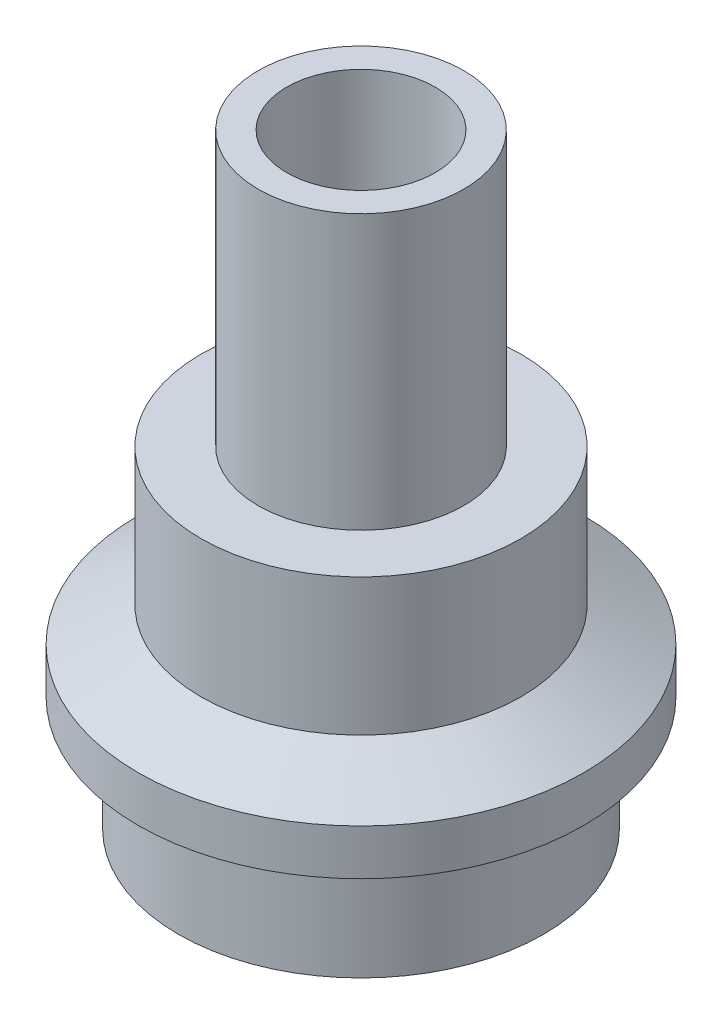
ISO-10303-21;
HEADER;
FILE_DESCRIPTION(('STEP AP214'),'2;1');
FILE_NAME('part.step','',(''),(''),'','','');
FILE_SCHEMA(('AUTOMOTIVE_DESIGN { 1 0 10303 214 1 1 1 1 }'));
ENDSEC;
DATA;
#1=APPLICATION_CONTEXT('core data for automotive mechanical design processes');
#2=APPLICATION_PROTOCOL_DEFINITION('international standard','automotive_design',2000,#1);
#3=PRODUCT_CONTEXT('',#1,'mechanical');
#4=PRODUCT('Part','Part','',(#3));
#5=PRODUCT_RELATED_PRODUCT_CATEGORY('part','',(#4));
#6=PRODUCT_DEFINITION_FORMATION('','',#4);
#7=PRODUCT_DEFINITION_CONTEXT('part definition',#1,'design');
#8=PRODUCT_DEFINITION('design','',#6,#7);
#9=PRODUCT_DEFINITION_SHAPE('','',#8);
#10=(LENGTH_UNIT() NAMED_UNIT(*) SI_UNIT(.MILLI.,.METRE.));
#11=(NAMED_UNIT(*) PLANE_ANGLE_UNIT() SI_UNIT($,.RADIAN.));
#12=(NAMED_UNIT(*) SI_UNIT($,.STERADIAN.) SOLID_ANGLE_UNIT());
#13=UNCERTAINTY_MEASURE_WITH_UNIT(LENGTH_MEASURE(1.E-05),#10,'distance_accuracy_value','');
#14=(GEOMETRIC_REPRESENTATION_CONTEXT(3) GLOBAL_UNCERTAINTY_ASSIGNED_CONTEXT((#13)) GLOBAL_UNIT_ASSIGNED_CONTEXT((#10,
#11,#12)) REPRESENTATION_CONTEXT('',''));
#15=CARTESIAN_POINT('',(0.,0.,0.));
#16=DIRECTION('',(0.,0.,1.));
#17=DIRECTION('',(1.,0.,0.));
#18=AXIS2_PLACEMENT_3D('',#15,#16,#17);
#19=CARTESIAN_POINT('',(0.,0.,0.));
#20=DIRECTION('',(0.,-1.,0.));
#21=DIRECTION('',(0.,0.,-1.));
#22=AXIS2_PLACEMENT_3D('',#19,#20,#21);
#23=CYLINDRICAL_SURFACE('',#22,11.);
#24=CARTESIAN_POINT('',(0.,0.,0.));
#25=DIRECTION('',(0.,-1.,0.));
#26=DIRECTION('',(0.,0.,-1.));
#27=AXIS2_PLACEMENT_3D('',#24,#25,#26);
#28=CIRCLE('',#27,11.);
#29=CARTESIAN_POINT('',(0.,0.,-11.));
#30=VERTEX_POINT('',#29);
#31=EDGE_CURVE('E12',#30,#30,#28,.T.);
#32=ORIENTED_EDGE('',*,*,#31,.T.);
#33=EDGE_LOOP('',(#32));
#34=FACE_BOUND('',#33,.T.);
#35=CARTESIAN_POINT('',(0.,11.,0.));
#36=DIRECTION('',(0.,-1.,0.));
#37=DIRECTION('',(0.,0.,-1.));
#38=AXIS2_PLACEMENT_3D('',#35,#36,#37);
#39=CIRCLE('',#38,11.);
#40=CARTESIAN_POINT('',(0.,11.,-11.));
#41=VERTEX_POINT('',#40);
#42=EDGE_CURVE('E102',#41,#41,#39,.T.);
#43=ORIENTED_EDGE('',*,*,#42,.F.);
#44=EDGE_LOOP('',(#43));
#45=FACE_BOUND('',#44,.T.);
#46=ADVANCED_FACE('F50',(#34,#45),#23,.F.);
#47=CARTESIAN_POINT('',(11.,0.,0.));
#48=DIRECTION('',(0.,-1.,0.));
#49=DIRECTION('',(0.,0.,-1.));
#50=AXIS2_PLACEMENT_3D('',#47,#48,#49);
#51=PLANE('',#50);
#52=CARTESIAN_POINT('',(0.,0.,0.));
#53=DIRECTION('',(0.,-1.,0.));
#54=DIRECTION('',(0.,0.,-1.));
#55=AXIS2_PLACEMENT_3D('',#52,#53,#54);
#56=CIRCLE('',#55,16.);
#57=CARTESIAN_POINT('',(0.,0.,-16.));
#58=VERTEX_POINT('',#57);
#59=EDGE_CURVE('E56',#58,#58,#56,.T.);
#60=ORIENTED_EDGE('',*,*,#59,.T.);
#61=EDGE_LOOP('',(#60));
#62=FACE_BOUND('',#61,.T.);
#63=ORIENTED_EDGE('',*,*,#31,.F.);
#64=EDGE_LOOP('',(#63));
#65=FACE_BOUND('',#64,.T.);
#66=ADVANCED_FACE('F110',(#62,#65),#51,.T.);
#67=CARTESIAN_POINT('',(0.,0.,0.));
#68=DIRECTION('',(0.,-1.,0.));
#69=DIRECTION('',(0.,0.,-1.));
#70=AXIS2_PLACEMENT_3D('',#67,#68,#69);
#71=CYLINDRICAL_SURFACE('',#70,16.);
#72=CARTESIAN_POINT('',(0.,10.,0.));
#73=DIRECTION('',(0.,-1.,0.));
#74=DIRECTION('',(0.,0.,-1.));
#75=AXIS2_PLACEMENT_3D('',#72,#73,#74);
#76=CIRCLE('',#75,16.);
#77=CARTESIAN_POINT('',(0.,10.,-16.));
#78=VERTEX_POINT('',#77);
#79=EDGE_CURVE('E60',#78,#78,#76,.T.);
#80=ORIENTED_EDGE('',*,*,#79,.T.);
#81=EDGE_LOOP('',(#80));
#82=FACE_BOUND('',#81,.T.);
#83=ORIENTED_EDGE('',*,*,#59,.F.);
#84=EDGE_LOOP('',(#83));
#85=FACE_BOUND('',#84,.T.);
#86=ADVANCED_FACE('F114',(#82,#85),#71,.T.);
#87=CARTESIAN_POINT('',(16.,10.,0.));
#88=DIRECTION('',(0.,-1.,0.));
#89=DIRECTION('',(0.,0.,-1.));
#90=AXIS2_PLACEMENT_3D('',#87,#88,#89);
#91=PLANE('',#90);
#92=CARTESIAN_POINT('',(0.,10.,0.));
#93=DIRECTION('',(0.,-1.,0.));
#94=DIRECTION('',(0.,0.,-1.));
#95=AXIS2_PLACEMENT_3D('',#92,#93,#94);
#96=CIRCLE('',#95,19.5);
#97=CARTESIAN_POINT('',(0.,10.,-19.5));
#98=VERTEX_POINT('',#97);
#99=EDGE_CURVE('E64',#98,#98,#96,.T.);
#100=ORIENTED_EDGE('',*,*,#99,.T.);
#101=EDGE_LOOP('',(#100));
#102=FACE_BOUND('',#101,.T.);
#103=ORIENTED_EDGE('',*,*,#79,.F.);
#104=EDGE_LOOP('',(#103));
#105=FACE_BOUND('',#104,.T.);
#106=ADVANCED_FACE('F118',(#102,#105),#91,.T.);
#107=CARTESIAN_POINT('',(0.,0.,0.));
#108=DIRECTION('',(0.,-1.,0.));
#109=DIRECTION('',(0.,0.,-1.));
#110=AXIS2_PLACEMENT_3D('',#107,#108,#109);
#111=CYLINDRICAL_SURFACE('',#110,19.5);
#112=CARTESIAN_POINT('',(0.,14.,0.));
#113=DIRECTION('',(0.,-1.,0.));
#114=DIRECTION('',(0.,0.,-1.));
#115=AXIS2_PLACEMENT_3D('',#112,#113,#114);
#116=CIRCLE('',#115,19.5);
#117=CARTESIAN_POINT('',(0.,14.,-19.5));
#118=VERTEX_POINT('',#117);
#119=EDGE_CURVE('E69',#118,#118,#116,.T.);
#120=ORIENTED_EDGE('',*,*,#119,.T.);
#121=EDGE_LOOP('',(#120));
#122=FACE_BOUND('',#121,.T.);
#123=ORIENTED_EDGE('',*,*,#99,.F.);
#124=EDGE_LOOP('',(#123));
#125=FACE_BOUND('',#124,.T.);
#126=ADVANCED_FACE('F125',(#122,#125),#111,.T.);
#127=CARTESIAN_POINT('',(0.,14.,0.));
#128=DIRECTION('',(0.,-1.,0.));
#129=DIRECTION('',(0.,0.,-1.));
#130=AXIS2_PLACEMENT_3D('',#127,#128,#129);
#131=CONICAL_SURFACE('',#130,19.5,1.07144960511477);
#132=CARTESIAN_POINT('',(0.,17.,0.));
#133=DIRECTION('',(0.,-1.,0.));
#134=DIRECTION('',(0.,0.,-1.));
#135=AXIS2_PLACEMENT_3D('',#132,#133,#134);
#136=CIRCLE('',#135,14.);
#137=CARTESIAN_POINT('',(0.,17.,-14.));
#138=VERTEX_POINT('',#137);
#139=EDGE_CURVE('E72',#138,#138,#136,.T.);
#140=ORIENTED_EDGE('',*,*,#139,.T.);
#141=EDGE_LOOP('',(#140));
#142=FACE_BOUND('',#141,.T.);
#143=ORIENTED_EDGE('',*,*,#119,.F.);
#144=EDGE_LOOP('',(#143));
#145=FACE_BOUND('',#144,.T.);
#146=ADVANCED_FACE('F129',(#142,#145),#131,.T.);
#147=CARTESIAN_POINT('',(0.,0.,0.));
#148=DIRECTION('',(0.,-1.,0.));
#149=DIRECTION('',(0.,0.,-1.));
#150=AXIS2_PLACEMENT_3D('',#147,#148,#149);
#151=CYLINDRICAL_SURFACE('',#150,14.);
#152=CARTESIAN_POINT('',(0.,29.,0.));
#153=DIRECTION('',(0.,-1.,0.));
#154=DIRECTION('',(0.,0.,-1.));
#155=AXIS2_PLACEMENT_3D('',#152,#153,#154);
#156=CIRCLE('',#155,14.);
#157=CARTESIAN_POINT('',(0.,29.,-14.));
#158=VERTEX_POINT('',#157);
#159=EDGE_CURVE('E75',#158,#158,#156,.T.);
#160=ORIENTED_EDGE('',*,*,#159,.T.);
#161=EDGE_LOOP('',(#160));
#162=FACE_BOUND('',#161,.T.);
#163=ORIENTED_EDGE('',*,*,#139,.F.);
#164=EDGE_LOOP('',(#163));
#165=FACE_BOUND('',#164,.T.);
#166=ADVANCED_FACE('F133',(#162,#165),#151,.T.);
#167=CARTESIAN_POINT('',(14.,29.,0.));
#168=DIRECTION('',(0.,1.,0.));
#169=DIRECTION('',(0.,0.,1.));
#170=AXIS2_PLACEMENT_3D('',#167,#168,#169);
#171=PLANE('',#170);
#172=CARTESIAN_POINT('',(0.,29.,0.));
#173=DIRECTION('',(0.,-1.,0.));
#174=DIRECTION('',(0.,0.,-1.));
#175=AXIS2_PLACEMENT_3D('',#172,#173,#174);
#176=CIRCLE('',#175,9.);
#177=CARTESIAN_POINT('',(0.,29.,-9.));
#178=VERTEX_POINT('',#177);
#179=EDGE_CURVE('E78',#178,#178,#176,.T.);
#180=ORIENTED_EDGE('',*,*,#179,.T.);
#181=EDGE_LOOP('',(#180));
#182=FACE_BOUND('',#181,.T.);
#183=ORIENTED_EDGE('',*,*,#159,.F.);
#184=EDGE_LOOP('',(#183));
#185=FACE_BOUND('',#184,.T.);
#186=ADVANCED_FACE('F137',(#182,#185),#171,.T.);
#187=CARTESIAN_POINT('',(0.,0.,0.));
#188=DIRECTION('',(0.,-1.,0.));
#189=DIRECTION('',(0.,0.,-1.));
#190=AXIS2_PLACEMENT_3D('',#187,#188,#189);
#191=CYLINDRICAL_SURFACE('',#190,9.);
#192=CARTESIAN_POINT('',(0.,53.,0.));
#193=DIRECTION('',(0.,-1.,0.));
#194=DIRECTION('',(0.,0.,-1.));
#195=AXIS2_PLACEMENT_3D('',#192,#193,#194);
#196=CIRCLE('',#195,9.);
#197=CARTESIAN_POINT('',(0.,53.,-9.));
#198=VERTEX_POINT('',#197);
#199=EDGE_CURVE('E81',#198,#198,#196,.T.);
#200=ORIENTED_EDGE('',*,*,#199,.T.);
#201=EDGE_LOOP('',(#200));
#202=FACE_BOUND('',#201,.T.);
#203=ORIENTED_EDGE('',*,*,#179,.F.);
#204=EDGE_LOOP('',(#203));
#205=FACE_BOUND('',#204,.T.);
#206=ADVANCED_FACE('F141',(#202,#205),#191,.T.);
#207=CARTESIAN_POINT('',(9.,53.,0.));
#208=DIRECTION('',(0.,1.,0.));
#209=DIRECTION('',(0.,0.,1.));
#210=AXIS2_PLACEMENT_3D('',#207,#208,#209);
#211=PLANE('',#210);
#212=CARTESIAN_POINT('',(0.,53.,0.));
#213=DIRECTION('',(0.,-1.,0.));
#214=DIRECTION('',(0.,0.,-1.));
#215=AXIS2_PLACEMENT_3D('',#212,#213,#214);
#216=CIRCLE('',#215,6.5);
#217=CARTESIAN_POINT('',(0.,53.,-6.5));
#218=VERTEX_POINT('',#217);
#219=EDGE_CURVE('E84',#218,#218,#216,.T.);
#220=ORIENTED_EDGE('',*,*,#219,.T.);
#221=EDGE_LOOP('',(#220));
#222=FACE_BOUND('',#221,.T.);
#223=ORIENTED_EDGE('',*,*,#199,.F.);
#224=EDGE_LOOP('',(#223));
#225=FACE_BOUND('',#224,.T.);
#226=ADVANCED_FACE('F145',(#222,#225),#211,.T.);
#227=CARTESIAN_POINT('',(0.,0.,0.));
#228=DIRECTION('',(0.,-1.,0.));
#229=DIRECTION('',(0.,0.,-1.));
#230=AXIS2_PLACEMENT_3D('',#227,#228,#229);
#231=CYLINDRICAL_SURFACE('',#230,6.5);
#232=CARTESIAN_POINT('',(0.,41.,0.));
#233=DIRECTION('',(0.,-1.,0.));
#234=DIRECTION('',(0.,0.,-1.));
#235=AXIS2_PLACEMENT_3D('',#232,#233,#234);
#236=CIRCLE('',#235,6.5);
#237=CARTESIAN_POINT('',(0.,41.,-6.5));
#238=VERTEX_POINT('',#237);
#239=EDGE_CURVE('E87',#238,#238,#236,.T.);
#240=ORIENTED_EDGE('',*,*,#239,.T.);
#241=EDGE_LOOP('',(#240));
#242=FACE_BOUND('',#241,.T.);
#243=ORIENTED_EDGE('',*,*,#219,.F.);
#244=EDGE_LOOP('',(#243));
#245=FACE_BOUND('',#244,.T.);
#246=ADVANCED_FACE('F149',(#242,#245),#231,.F.);
#247=CARTESIAN_POINT('',(0.,41.,0.));
#248=DIRECTION('',(0.,1.,0.));
#249=DIRECTION('',(0.,0.,1.));
#250=AXIS2_PLACEMENT_3D('',#247,#248,#249);
#251=CONICAL_SURFACE('',#250,6.5,1.29249666778979);
#252=CARTESIAN_POINT('',(0.,40.,0.));
#253=DIRECTION('',(0.,-1.,0.));
#254=DIRECTION('',(0.,0.,-1.));
#255=AXIS2_PLACEMENT_3D('',#252,#253,#254);
#256=CIRCLE('',#255,3.);
#257=CARTESIAN_POINT('',(0.,40.,-3.));
#258=VERTEX_POINT('',#257);
#259=EDGE_CURVE('E90',#258,#258,#256,.T.);
#260=ORIENTED_EDGE('',*,*,#259,.T.);
#261=EDGE_LOOP('',(#260));
#262=FACE_BOUND('',#261,.T.);
#263=ORIENTED_EDGE('',*,*,#239,.F.);
#264=EDGE_LOOP('',(#263));
#265=FACE_BOUND('',#264,.T.);
#266=ADVANCED_FACE('F153',(#262,#265),#251,.F.);
#267=CARTESIAN_POINT('',(0.,0.,0.));
#268=DIRECTION('',(0.,-1.,0.));
#269=DIRECTION('',(0.,0.,-1.));
#270=AXIS2_PLACEMENT_3D('',#267,#268,#269);
#271=CYLINDRICAL_SURFACE('',#270,3.);
#272=CARTESIAN_POINT('',(0.,38.,0.));
#273=DIRECTION('',(0.,-1.,0.));
#274=DIRECTION('',(0.,0.,-1.));
#275=AXIS2_PLACEMENT_3D('',#272,#273,#274);
#276=CIRCLE('',#275,3.);
#277=CARTESIAN_POINT('',(0.,38.,-3.));
#278=VERTEX_POINT('',#277);
#279=EDGE_CURVE('E93',#278,#278,#276,.T.);
#280=ORIENTED_EDGE('',*,*,#279,.T.);
#281=EDGE_LOOP('',(#280));
#282=FACE_BOUND('',#281,.T.);
#283=ORIENTED_EDGE('',*,*,#259,.F.);
#284=EDGE_LOOP('',(#283));
#285=FACE_BOUND('',#284,.T.);
#286=ADVANCED_FACE('F157',(#282,#285),#271,.F.);
#287=CARTESIAN_POINT('',(3.,38.,0.));
#288=DIRECTION('',(0.,-1.,0.));
#289=DIRECTION('',(0.,0.,-1.));
#290=AXIS2_PLACEMENT_3D('',#287,#288,#289);
#291=PLANE('',#290);
#292=CARTESIAN_POINT('',(0.,38.,0.));
#293=DIRECTION('',(0.,-1.,0.));
#294=DIRECTION('',(0.,0.,-1.));
#295=AXIS2_PLACEMENT_3D('',#292,#293,#294);
#296=CIRCLE('',#295,3.49999999999999);
#297=CARTESIAN_POINT('',(0.,38.,-3.49999999999999));
#298=VERTEX_POINT('',#297);
#299=EDGE_CURVE('E96',#298,#298,#296,.T.);
#300=ORIENTED_EDGE('',*,*,#299,.T.);
#301=EDGE_LOOP('',(#300));
#302=FACE_BOUND('',#301,.T.);
#303=ORIENTED_EDGE('',*,*,#279,.F.);
#304=EDGE_LOOP('',(#303));
#305=FACE_BOUND('',#304,.T.);
#306=ADVANCED_FACE('F161',(#302,#305),#291,.T.);
#307=CARTESIAN_POINT('',(0.,0.,0.));
#308=DIRECTION('',(0.,-1.,0.));
#309=DIRECTION('',(0.,0.,-1.));
#310=AXIS2_PLACEMENT_3D('',#307,#308,#309);
#311=CYLINDRICAL_SURFACE('',#310,3.5);
#312=CARTESIAN_POINT('',(0.,11.,0.));
#313=DIRECTION('',(0.,-1.,0.));
#314=DIRECTION('',(0.,0.,-1.));
#315=AXIS2_PLACEMENT_3D('',#312,#313,#314);
#316=CIRCLE('',#315,3.5);
#317=CARTESIAN_POINT('',(0.,11.,-3.5));
#318=VERTEX_POINT('',#317);
#319=EDGE_CURVE('E99',#318,#318,#316,.T.);
#320=ORIENTED_EDGE('',*,*,#319,.T.);
#321=EDGE_LOOP('',(#320));
#322=FACE_BOUND('',#321,.T.);
#323=ORIENTED_EDGE('',*,*,#299,.F.);
#324=EDGE_LOOP('',(#323));
#325=FACE_BOUND('',#324,.T.);
#326=ADVANCED_FACE('F165',(#322,#325),#311,.F.);
#327=CARTESIAN_POINT('',(3.5,11.,0.));
#328=DIRECTION('',(0.,-1.,0.));
#329=DIRECTION('',(0.,0.,-1.));
#330=AXIS2_PLACEMENT_3D('',#327,#328,#329);
#331=PLANE('',#330);
#332=ORIENTED_EDGE('',*,*,#42,.T.);
#333=EDGE_LOOP('',(#332));
#334=FACE_BOUND('',#333,.T.);
#335=ORIENTED_EDGE('',*,*,#319,.F.);
#336=EDGE_LOOP('',(#335));
#337=FACE_BOUND('',#336,.T.);
#338=ADVANCED_FACE('F106',(#334,#337),#331,.T.);
#339=CLOSED_SHELL('',(#46,#66,#86,#106,#126,#146,#166,#186,#206,#226,#246,#266,#286,#306,#326,#338));
#340=MANIFOLD_SOLID_BREP('B2',#339);
#341=ADVANCED_BREP_SHAPE_REPRESENTATION('',(#18,#340),#14);
#342=SHAPE_DEFINITION_REPRESENTATION(#9,#341);
ENDSEC;
END-ISO-10303-21;
